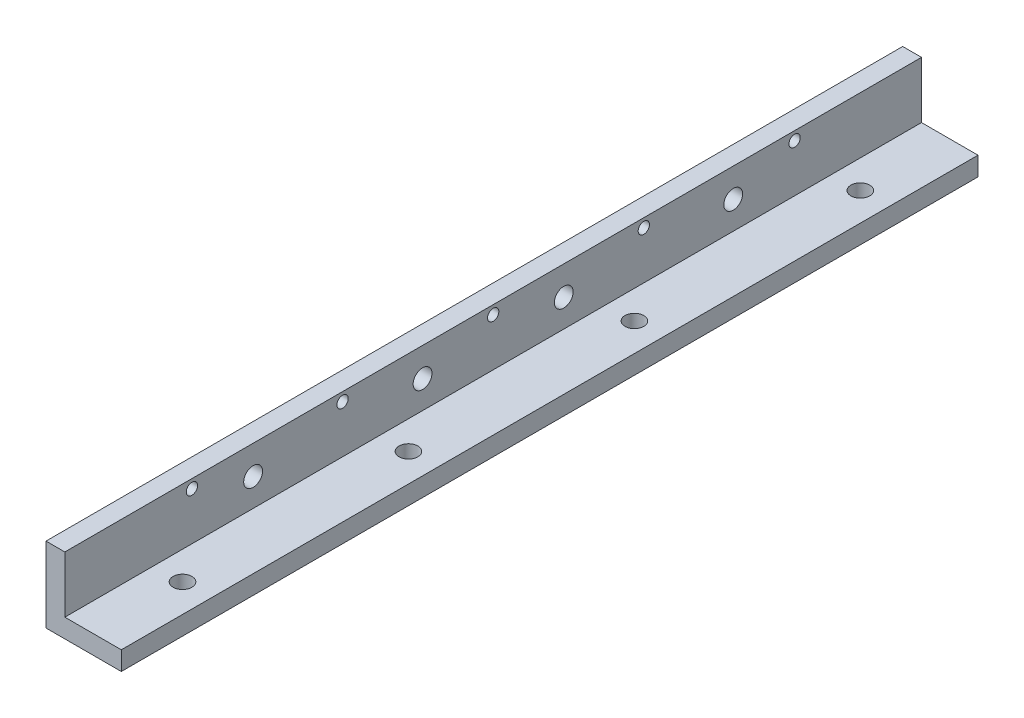
ISO-10303-21;
HEADER;
FILE_DESCRIPTION(('STEP AP214'),'2;1');
FILE_NAME('part.step','',(''),(''),'','','');
FILE_SCHEMA(('AUTOMOTIVE_DESIGN { 1 0 10303 214 1 1 1 1 }'));
ENDSEC;
DATA;
#1=APPLICATION_CONTEXT('core data for automotive mechanical design processes');
#2=APPLICATION_PROTOCOL_DEFINITION('international standard','automotive_design',2000,#1);
#3=PRODUCT_CONTEXT('',#1,'mechanical');
#4=PRODUCT('Part','Part','',(#3));
#5=PRODUCT_RELATED_PRODUCT_CATEGORY('part','',(#4));
#6=PRODUCT_DEFINITION_FORMATION('','',#4);
#7=PRODUCT_DEFINITION_CONTEXT('part definition',#1,'design');
#8=PRODUCT_DEFINITION('design','',#6,#7);
#9=PRODUCT_DEFINITION_SHAPE('','',#8);
#10=(LENGTH_UNIT() NAMED_UNIT(*) SI_UNIT(.MILLI.,.METRE.));
#11=(NAMED_UNIT(*) PLANE_ANGLE_UNIT() SI_UNIT($,.RADIAN.));
#12=(NAMED_UNIT(*) SI_UNIT($,.STERADIAN.) SOLID_ANGLE_UNIT());
#13=UNCERTAINTY_MEASURE_WITH_UNIT(LENGTH_MEASURE(1.E-05),#10,'distance_accuracy_value','');
#14=(GEOMETRIC_REPRESENTATION_CONTEXT(3) GLOBAL_UNCERTAINTY_ASSIGNED_CONTEXT((#13)) GLOBAL_UNIT_ASSIGNED_CONTEXT((#10,
#11,#12)) REPRESENTATION_CONTEXT('',''));
#15=CARTESIAN_POINT('',(0.,0.,0.));
#16=DIRECTION('',(0.,0.,1.));
#17=DIRECTION('',(1.,0.,0.));
#18=AXIS2_PLACEMENT_3D('',#15,#16,#17);
#19=CARTESIAN_POINT('',(0.,0.,227.5));
#20=DIRECTION('',(0.,1.,0.));
#21=DIRECTION('',(0.,0.,1.));
#22=AXIS2_PLACEMENT_3D('',#19,#20,#21);
#23=PLANE('',#22);
#24=CARTESIAN_POINT('',(12.5,0.,203.75));
#25=DIRECTION('',(0.,1.,0.));
#26=DIRECTION('',(0.,0.,1.));
#27=AXIS2_PLACEMENT_3D('',#24,#25,#26);
#28=CIRCLE('',#27,2.5);
#29=CARTESIAN_POINT('',(12.5,0.,206.25));
#30=VERTEX_POINT('',#29);
#31=EDGE_CURVE('E166',#30,#30,#28,.T.);
#32=ORIENTED_EDGE('',*,*,#31,.T.);
#33=EDGE_LOOP('',(#32));
#34=FACE_BOUND('',#33,.T.);
#35=CARTESIAN_POINT('',(12.5,0.,143.75));
#36=DIRECTION('',(0.,1.,0.));
#37=DIRECTION('',(0.,0.,1.));
#38=AXIS2_PLACEMENT_3D('',#35,#36,#37);
#39=CIRCLE('',#38,2.5);
#40=CARTESIAN_POINT('',(12.5,0.,146.25));
#41=VERTEX_POINT('',#40);
#42=EDGE_CURVE('E170',#41,#41,#39,.T.);
#43=ORIENTED_EDGE('',*,*,#42,.T.);
#44=EDGE_LOOP('',(#43));
#45=FACE_BOUND('',#44,.T.);
#46=CARTESIAN_POINT('',(12.5,0.,83.75));
#47=DIRECTION('',(0.,1.,0.));
#48=DIRECTION('',(0.,0.,1.));
#49=AXIS2_PLACEMENT_3D('',#46,#47,#48);
#50=CIRCLE('',#49,2.5);
#51=CARTESIAN_POINT('',(12.5,0.,86.25));
#52=VERTEX_POINT('',#51);
#53=EDGE_CURVE('E174',#52,#52,#50,.T.);
#54=ORIENTED_EDGE('',*,*,#53,.T.);
#55=EDGE_LOOP('',(#54));
#56=FACE_BOUND('',#55,.T.);
#57=CARTESIAN_POINT('',(12.5,0.,23.75));
#58=DIRECTION('',(0.,1.,0.));
#59=DIRECTION('',(0.,0.,1.));
#60=AXIS2_PLACEMENT_3D('',#57,#58,#59);
#61=CIRCLE('',#60,2.5);
#62=CARTESIAN_POINT('',(12.5,0.,26.25));
#63=VERTEX_POINT('',#62);
#64=EDGE_CURVE('E123',#63,#63,#61,.T.);
#65=ORIENTED_EDGE('',*,*,#64,.T.);
#66=EDGE_LOOP('',(#65));
#67=FACE_BOUND('',#66,.T.);
#68=DIRECTION('',(1.,0.,0.));
#69=VECTOR('',#68,1.);
#70=CARTESIAN_POINT('',(0.,0.,0.));
#71=LINE('',#70,#69);
#72=CARTESIAN_POINT('',(0.,0.,0.));
#73=VERTEX_POINT('',#72);
#74=CARTESIAN_POINT('',(20.,0.,0.));
#75=VERTEX_POINT('',#74);
#76=EDGE_CURVE('E120',#73,#75,#71,.T.);
#77=ORIENTED_EDGE('',*,*,#76,.T.);
#78=DIRECTION('',(0.,0.,-1.));
#79=VECTOR('',#78,1.);
#80=CARTESIAN_POINT('',(20.,0.,227.5));
#81=LINE('',#80,#79);
#82=CARTESIAN_POINT('',(20.,0.,227.5));
#83=VERTEX_POINT('',#82);
#84=EDGE_CURVE('E11',#83,#75,#81,.T.);
#85=ORIENTED_EDGE('',*,*,#84,.F.);
#86=DIRECTION('',(1.,0.,0.));
#87=VECTOR('',#86,1.);
#88=CARTESIAN_POINT('',(0.,0.,227.5));
#89=LINE('',#88,#87);
#90=CARTESIAN_POINT('',(0.,0.,227.5));
#91=VERTEX_POINT('',#90);
#92=EDGE_CURVE('E135',#91,#83,#89,.T.);
#93=ORIENTED_EDGE('',*,*,#92,.F.);
#94=DIRECTION('',(0.,0.,-1.));
#95=VECTOR('',#94,1.);
#96=CARTESIAN_POINT('',(0.,0.,227.5));
#97=LINE('',#96,#95);
#98=EDGE_CURVE('E52',#91,#73,#97,.T.);
#99=ORIENTED_EDGE('',*,*,#98,.T.);
#100=EDGE_LOOP('',(#77,#85,#93,#99));
#101=FACE_BOUND('',#100,.T.);
#102=ADVANCED_FACE('F36',(#34,#45,#56,#67,#101),#23,.F.);
#103=CARTESIAN_POINT('',(20.,0.,227.5));
#104=DIRECTION('',(-1.,0.,0.));
#105=DIRECTION('',(0.,0.,1.));
#106=AXIS2_PLACEMENT_3D('',#103,#104,#105);
#107=PLANE('',#106);
#108=DIRECTION('',(0.,1.,0.));
#109=VECTOR('',#108,1.);
#110=CARTESIAN_POINT('',(20.,0.,0.));
#111=LINE('',#110,#109);
#112=CARTESIAN_POINT('',(20.,5.,0.));
#113=VERTEX_POINT('',#112);
#114=EDGE_CURVE('E122',#75,#113,#111,.T.);
#115=ORIENTED_EDGE('',*,*,#114,.T.);
#116=DIRECTION('',(0.,0.,-1.));
#117=VECTOR('',#116,1.);
#118=CARTESIAN_POINT('',(20.,5.,227.5));
#119=LINE('',#118,#117);
#120=CARTESIAN_POINT('',(20.,5.,227.5));
#121=VERTEX_POINT('',#120);
#122=EDGE_CURVE('E44',#121,#113,#119,.T.);
#123=ORIENTED_EDGE('',*,*,#122,.F.);
#124=DIRECTION('',(0.,1.,0.));
#125=VECTOR('',#124,1.);
#126=CARTESIAN_POINT('',(20.,0.,227.5));
#127=LINE('',#126,#125);
#128=EDGE_CURVE('E84',#83,#121,#127,.T.);
#129=ORIENTED_EDGE('',*,*,#128,.F.);
#130=ORIENTED_EDGE('',*,*,#84,.T.);
#131=EDGE_LOOP('',(#115,#123,#129,#130));
#132=FACE_BOUND('',#131,.T.);
#133=ADVANCED_FACE('F141',(#132),#107,.F.);
#134=CARTESIAN_POINT('',(0.,5.,227.5));
#135=DIRECTION('',(0.,1.,0.));
#136=DIRECTION('',(0.,0.,1.));
#137=AXIS2_PLACEMENT_3D('',#134,#135,#136);
#138=PLANE('',#137);
#139=CARTESIAN_POINT('',(12.5,5.,203.75));
#140=DIRECTION('',(0.,1.,0.));
#141=DIRECTION('',(0.,0.,1.));
#142=AXIS2_PLACEMENT_3D('',#139,#140,#141);
#143=CIRCLE('',#142,2.5);
#144=CARTESIAN_POINT('',(12.5,5.,206.25));
#145=VERTEX_POINT('',#144);
#146=EDGE_CURVE('E193',#145,#145,#143,.T.);
#147=ORIENTED_EDGE('',*,*,#146,.F.);
#148=EDGE_LOOP('',(#147));
#149=FACE_BOUND('',#148,.T.);
#150=CARTESIAN_POINT('',(12.5,5.,143.75));
#151=DIRECTION('',(0.,1.,0.));
#152=DIRECTION('',(0.,0.,1.));
#153=AXIS2_PLACEMENT_3D('',#150,#151,#152);
#154=CIRCLE('',#153,2.5);
#155=CARTESIAN_POINT('',(12.5,5.,146.25));
#156=VERTEX_POINT('',#155);
#157=EDGE_CURVE('E189',#156,#156,#154,.T.);
#158=ORIENTED_EDGE('',*,*,#157,.F.);
#159=EDGE_LOOP('',(#158));
#160=FACE_BOUND('',#159,.T.);
#161=CARTESIAN_POINT('',(12.5,5.,83.75));
#162=DIRECTION('',(0.,1.,0.));
#163=DIRECTION('',(0.,0.,1.));
#164=AXIS2_PLACEMENT_3D('',#161,#162,#163);
#165=CIRCLE('',#164,2.5);
#166=CARTESIAN_POINT('',(12.5,5.,86.25));
#167=VERTEX_POINT('',#166);
#168=EDGE_CURVE('E185',#167,#167,#165,.T.);
#169=ORIENTED_EDGE('',*,*,#168,.F.);
#170=EDGE_LOOP('',(#169));
#171=FACE_BOUND('',#170,.T.);
#172=CARTESIAN_POINT('',(12.5,5.,23.75));
#173=DIRECTION('',(0.,1.,0.));
#174=DIRECTION('',(0.,0.,1.));
#175=AXIS2_PLACEMENT_3D('',#172,#173,#174);
#176=CIRCLE('',#175,2.5);
#177=CARTESIAN_POINT('',(12.5,5.,26.25));
#178=VERTEX_POINT('',#177);
#179=EDGE_CURVE('E181',#178,#178,#176,.T.);
#180=ORIENTED_EDGE('',*,*,#179,.F.);
#181=EDGE_LOOP('',(#180));
#182=FACE_BOUND('',#181,.T.);
#183=DIRECTION('',(1.,0.,0.));
#184=VECTOR('',#183,1.);
#185=CARTESIAN_POINT('',(0.,5.,0.));
#186=LINE('',#185,#184);
#187=CARTESIAN_POINT('',(5.,5.,0.));
#188=VERTEX_POINT('',#187);
#189=EDGE_CURVE('E126',#188,#113,#186,.T.);
#190=ORIENTED_EDGE('',*,*,#189,.F.);
#191=DIRECTION('',(0.,0.,-1.));
#192=VECTOR('',#191,1.);
#193=CARTESIAN_POINT('',(5.,5.,227.5));
#194=LINE('',#193,#192);
#195=CARTESIAN_POINT('',(5.,5.,227.5));
#196=VERTEX_POINT('',#195);
#197=EDGE_CURVE('E112',#196,#188,#194,.T.);
#198=ORIENTED_EDGE('',*,*,#197,.F.);
#199=DIRECTION('',(1.,0.,0.));
#200=VECTOR('',#199,1.);
#201=CARTESIAN_POINT('',(0.,5.,227.5));
#202=LINE('',#201,#200);
#203=EDGE_CURVE('E102',#196,#121,#202,.T.);
#204=ORIENTED_EDGE('',*,*,#203,.T.);
#205=ORIENTED_EDGE('',*,*,#122,.T.);
#206=EDGE_LOOP('',(#190,#198,#204,#205));
#207=FACE_BOUND('',#206,.T.);
#208=ADVANCED_FACE('F140',(#149,#160,#171,#182,#207),#138,.T.);
#209=CARTESIAN_POINT('',(5.,0.,227.5));
#210=DIRECTION('',(-1.,0.,0.));
#211=DIRECTION('',(0.,0.,1.));
#212=AXIS2_PLACEMENT_3D('',#209,#210,#211);
#213=PLANE('',#212);
#214=CARTESIAN_POINT('',(5.,17.6675,193.75));
#215=DIRECTION('',(-1.,0.,0.));
#216=DIRECTION('',(0.,0.,1.));
#217=AXIS2_PLACEMENT_3D('',#214,#215,#216);
#218=CIRCLE('',#217,1.5);
#219=CARTESIAN_POINT('',(5.,17.6675,195.25));
#220=VERTEX_POINT('',#219);
#221=EDGE_CURVE('E244',#220,#220,#218,.T.);
#222=ORIENTED_EDGE('',*,*,#221,.T.);
#223=EDGE_LOOP('',(#222));
#224=FACE_BOUND('',#223,.T.);
#225=CARTESIAN_POINT('',(5.,17.6675,153.75));
#226=DIRECTION('',(-1.,0.,0.));
#227=DIRECTION('',(0.,0.,1.));
#228=AXIS2_PLACEMENT_3D('',#225,#226,#227);
#229=CIRCLE('',#228,1.50000000000003);
#230=CARTESIAN_POINT('',(5.,17.6675,155.25));
#231=VERTEX_POINT('',#230);
#232=EDGE_CURVE('E238',#231,#231,#229,.T.);
#233=ORIENTED_EDGE('',*,*,#232,.T.);
#234=EDGE_LOOP('',(#233));
#235=FACE_BOUND('',#234,.T.);
#236=CARTESIAN_POINT('',(5.,17.6675,113.75));
#237=DIRECTION('',(-1.,0.,0.));
#238=DIRECTION('',(0.,0.,1.));
#239=AXIS2_PLACEMENT_3D('',#236,#237,#238);
#240=CIRCLE('',#239,1.5);
#241=CARTESIAN_POINT('',(5.,17.6675,115.25));
#242=VERTEX_POINT('',#241);
#243=EDGE_CURVE('E232',#242,#242,#240,.T.);
#244=ORIENTED_EDGE('',*,*,#243,.T.);
#245=EDGE_LOOP('',(#244));
#246=FACE_BOUND('',#245,.T.);
#247=CARTESIAN_POINT('',(5.,17.6675,73.75));
#248=DIRECTION('',(-1.,0.,0.));
#249=DIRECTION('',(0.,0.,1.));
#250=AXIS2_PLACEMENT_3D('',#247,#248,#249);
#251=CIRCLE('',#250,1.5);
#252=CARTESIAN_POINT('',(5.,17.6675,75.25));
#253=VERTEX_POINT('',#252);
#254=EDGE_CURVE('E226',#253,#253,#251,.T.);
#255=ORIENTED_EDGE('',*,*,#254,.T.);
#256=EDGE_LOOP('',(#255));
#257=FACE_BOUND('',#256,.T.);
#258=CARTESIAN_POINT('',(5.,17.6675,33.7042074641719));
#259=DIRECTION('',(-1.,0.,0.));
#260=DIRECTION('',(0.,0.,1.));
#261=AXIS2_PLACEMENT_3D('',#258,#259,#260);
#262=CIRCLE('',#261,1.49999999999999);
#263=CARTESIAN_POINT('',(5.,17.6675,35.2042074641719));
#264=VERTEX_POINT('',#263);
#265=EDGE_CURVE('E220',#264,#264,#262,.T.);
#266=ORIENTED_EDGE('',*,*,#265,.T.);
#267=EDGE_LOOP('',(#266));
#268=FACE_BOUND('',#267,.T.);
#269=CARTESIAN_POINT('',(5.,12.3461631582441,177.5));
#270=DIRECTION('',(1.,0.,0.));
#271=DIRECTION('',(0.,0.,-1.));
#272=AXIS2_PLACEMENT_3D('',#269,#270,#271);
#273=CIRCLE('',#272,2.5);
#274=CARTESIAN_POINT('',(5.,12.3461631582441,175.));
#275=VERTEX_POINT('',#274);
#276=EDGE_CURVE('E217',#275,#275,#273,.T.);
#277=ORIENTED_EDGE('',*,*,#276,.F.);
#278=EDGE_LOOP('',(#277));
#279=FACE_BOUND('',#278,.T.);
#280=CARTESIAN_POINT('',(5.,12.3461631582441,132.5));
#281=DIRECTION('',(1.,0.,0.));
#282=DIRECTION('',(0.,0.,-1.));
#283=AXIS2_PLACEMENT_3D('',#280,#281,#282);
#284=CIRCLE('',#283,2.5);
#285=CARTESIAN_POINT('',(5.,12.3461631582441,130.));
#286=VERTEX_POINT('',#285);
#287=EDGE_CURVE('E211',#286,#286,#284,.T.);
#288=ORIENTED_EDGE('',*,*,#287,.F.);
#289=EDGE_LOOP('',(#288));
#290=FACE_BOUND('',#289,.T.);
#291=CARTESIAN_POINT('',(5.,12.3461631582441,95.));
#292=DIRECTION('',(1.,0.,0.));
#293=DIRECTION('',(0.,0.,-1.));
#294=AXIS2_PLACEMENT_3D('',#291,#292,#293);
#295=CIRCLE('',#294,2.5);
#296=CARTESIAN_POINT('',(5.,12.3461631582441,92.5));
#297=VERTEX_POINT('',#296);
#298=EDGE_CURVE('E205',#297,#297,#295,.T.);
#299=ORIENTED_EDGE('',*,*,#298,.F.);
#300=EDGE_LOOP('',(#299));
#301=FACE_BOUND('',#300,.T.);
#302=CARTESIAN_POINT('',(5.,12.3461631582441,50.));
#303=DIRECTION('',(1.,0.,0.));
#304=DIRECTION('',(0.,0.,-1.));
#305=AXIS2_PLACEMENT_3D('',#302,#303,#304);
#306=CIRCLE('',#305,2.5);
#307=CARTESIAN_POINT('',(5.,12.3461631582441,47.5));
#308=VERTEX_POINT('',#307);
#309=EDGE_CURVE('E199',#308,#308,#306,.T.);
#310=ORIENTED_EDGE('',*,*,#309,.F.);
#311=EDGE_LOOP('',(#310));
#312=FACE_BOUND('',#311,.T.);
#313=DIRECTION('',(0.,1.,0.));
#314=VECTOR('',#313,1.);
#315=CARTESIAN_POINT('',(5.,0.,0.));
#316=LINE('',#315,#314);
#317=CARTESIAN_POINT('',(5.,20.,0.));
#318=VERTEX_POINT('',#317);
#319=EDGE_CURVE('E109',#188,#318,#316,.T.);
#320=ORIENTED_EDGE('',*,*,#319,.T.);
#321=DIRECTION('',(0.,0.,-1.));
#322=VECTOR('',#321,1.);
#323=CARTESIAN_POINT('',(5.,20.,227.5));
#324=LINE('',#323,#322);
#325=CARTESIAN_POINT('',(5.,20.,227.5));
#326=VERTEX_POINT('',#325);
#327=EDGE_CURVE('E106',#326,#318,#324,.T.);
#328=ORIENTED_EDGE('',*,*,#327,.F.);
#329=DIRECTION('',(0.,1.,0.));
#330=VECTOR('',#329,1.);
#331=CARTESIAN_POINT('',(5.,0.,227.5));
#332=LINE('',#331,#330);
#333=EDGE_CURVE('E95',#196,#326,#332,.T.);
#334=ORIENTED_EDGE('',*,*,#333,.F.);
#335=ORIENTED_EDGE('',*,*,#197,.T.);
#336=EDGE_LOOP('',(#320,#328,#334,#335));
#337=FACE_BOUND('',#336,.T.);
#338=ADVANCED_FACE('F107',(#224,#235,#246,#257,#268,#279,#290,#301,#312,#337),#213,.F.);
#339=CARTESIAN_POINT('',(0.,20.,227.5));
#340=DIRECTION('',(0.,1.,0.));
#341=DIRECTION('',(0.,0.,1.));
#342=AXIS2_PLACEMENT_3D('',#339,#340,#341);
#343=PLANE('',#342);
#344=DIRECTION('',(1.,0.,0.));
#345=VECTOR('',#344,1.);
#346=CARTESIAN_POINT('',(0.,20.,0.));
#347=LINE('',#346,#345);
#348=CARTESIAN_POINT('',(0.,20.,0.));
#349=VERTEX_POINT('',#348);
#350=EDGE_CURVE('E130',#349,#318,#347,.T.);
#351=ORIENTED_EDGE('',*,*,#350,.F.);
#352=DIRECTION('',(0.,0.,-1.));
#353=VECTOR('',#352,1.);
#354=CARTESIAN_POINT('',(0.,20.,227.5));
#355=LINE('',#354,#353);
#356=CARTESIAN_POINT('',(0.,20.,227.5));
#357=VERTEX_POINT('',#356);
#358=EDGE_CURVE('E72',#357,#349,#355,.T.);
#359=ORIENTED_EDGE('',*,*,#358,.F.);
#360=DIRECTION('',(1.,0.,0.));
#361=VECTOR('',#360,1.);
#362=CARTESIAN_POINT('',(0.,20.,227.5));
#363=LINE('',#362,#361);
#364=EDGE_CURVE('E100',#357,#326,#363,.T.);
#365=ORIENTED_EDGE('',*,*,#364,.T.);
#366=ORIENTED_EDGE('',*,*,#327,.T.);
#367=EDGE_LOOP('',(#351,#359,#365,#366));
#368=FACE_BOUND('',#367,.T.);
#369=ADVANCED_FACE('F114',(#368),#343,.T.);
#370=CARTESIAN_POINT('',(0.,0.,227.5));
#371=DIRECTION('',(-1.,0.,0.));
#372=DIRECTION('',(0.,0.,1.));
#373=AXIS2_PLACEMENT_3D('',#370,#371,#372);
#374=PLANE('',#373);
#375=CARTESIAN_POINT('',(0.,17.6675,193.75));
#376=DIRECTION('',(-1.,0.,0.));
#377=DIRECTION('',(0.,0.,1.));
#378=AXIS2_PLACEMENT_3D('',#375,#376,#377);
#379=CIRCLE('',#378,1.5);
#380=CARTESIAN_POINT('',(0.,17.6675,195.25));
#381=VERTEX_POINT('',#380);
#382=EDGE_CURVE('E247',#381,#381,#379,.T.);
#383=ORIENTED_EDGE('',*,*,#382,.F.);
#384=EDGE_LOOP('',(#383));
#385=FACE_BOUND('',#384,.T.);
#386=CARTESIAN_POINT('',(0.,17.6675,153.75));
#387=DIRECTION('',(-1.,0.,0.));
#388=DIRECTION('',(0.,0.,1.));
#389=AXIS2_PLACEMENT_3D('',#386,#387,#388);
#390=CIRCLE('',#389,1.50000000000003);
#391=CARTESIAN_POINT('',(0.,17.6675,155.25));
#392=VERTEX_POINT('',#391);
#393=EDGE_CURVE('E241',#392,#392,#390,.T.);
#394=ORIENTED_EDGE('',*,*,#393,.F.);
#395=EDGE_LOOP('',(#394));
#396=FACE_BOUND('',#395,.T.);
#397=CARTESIAN_POINT('',(0.,17.6675,113.75));
#398=DIRECTION('',(-1.,0.,0.));
#399=DIRECTION('',(0.,0.,1.));
#400=AXIS2_PLACEMENT_3D('',#397,#398,#399);
#401=CIRCLE('',#400,1.5);
#402=CARTESIAN_POINT('',(0.,17.6675,115.25));
#403=VERTEX_POINT('',#402);
#404=EDGE_CURVE('E235',#403,#403,#401,.T.);
#405=ORIENTED_EDGE('',*,*,#404,.F.);
#406=EDGE_LOOP('',(#405));
#407=FACE_BOUND('',#406,.T.);
#408=CARTESIAN_POINT('',(0.,17.6675,73.75));
#409=DIRECTION('',(-1.,0.,0.));
#410=DIRECTION('',(0.,0.,1.));
#411=AXIS2_PLACEMENT_3D('',#408,#409,#410);
#412=CIRCLE('',#411,1.5);
#413=CARTESIAN_POINT('',(0.,17.6675,75.25));
#414=VERTEX_POINT('',#413);
#415=EDGE_CURVE('E229',#414,#414,#412,.T.);
#416=ORIENTED_EDGE('',*,*,#415,.F.);
#417=EDGE_LOOP('',(#416));
#418=FACE_BOUND('',#417,.T.);
#419=CARTESIAN_POINT('',(0.,17.6675,33.7042074641719));
#420=DIRECTION('',(-1.,0.,0.));
#421=DIRECTION('',(0.,0.,1.));
#422=AXIS2_PLACEMENT_3D('',#419,#420,#421);
#423=CIRCLE('',#422,1.49999999999999);
#424=CARTESIAN_POINT('',(0.,17.6675,35.2042074641719));
#425=VERTEX_POINT('',#424);
#426=EDGE_CURVE('E223',#425,#425,#423,.T.);
#427=ORIENTED_EDGE('',*,*,#426,.F.);
#428=EDGE_LOOP('',(#427));
#429=FACE_BOUND('',#428,.T.);
#430=CARTESIAN_POINT('',(0.,12.3461631582441,177.5));
#431=DIRECTION('',(1.,0.,0.));
#432=DIRECTION('',(0.,0.,-1.));
#433=AXIS2_PLACEMENT_3D('',#430,#431,#432);
#434=CIRCLE('',#433,2.5);
#435=CARTESIAN_POINT('',(0.,12.3461631582441,175.));
#436=VERTEX_POINT('',#435);
#437=EDGE_CURVE('E214',#436,#436,#434,.T.);
#438=ORIENTED_EDGE('',*,*,#437,.T.);
#439=EDGE_LOOP('',(#438));
#440=FACE_BOUND('',#439,.T.);
#441=CARTESIAN_POINT('',(0.,12.3461631582441,132.5));
#442=DIRECTION('',(1.,0.,0.));
#443=DIRECTION('',(0.,0.,-1.));
#444=AXIS2_PLACEMENT_3D('',#441,#442,#443);
#445=CIRCLE('',#444,2.5);
#446=CARTESIAN_POINT('',(0.,12.3461631582441,130.));
#447=VERTEX_POINT('',#446);
#448=EDGE_CURVE('E208',#447,#447,#445,.T.);
#449=ORIENTED_EDGE('',*,*,#448,.T.);
#450=EDGE_LOOP('',(#449));
#451=FACE_BOUND('',#450,.T.);
#452=CARTESIAN_POINT('',(0.,12.3461631582441,95.));
#453=DIRECTION('',(1.,0.,0.));
#454=DIRECTION('',(0.,0.,-1.));
#455=AXIS2_PLACEMENT_3D('',#452,#453,#454);
#456=CIRCLE('',#455,2.5);
#457=CARTESIAN_POINT('',(0.,12.3461631582441,92.5));
#458=VERTEX_POINT('',#457);
#459=EDGE_CURVE('E202',#458,#458,#456,.T.);
#460=ORIENTED_EDGE('',*,*,#459,.T.);
#461=EDGE_LOOP('',(#460));
#462=FACE_BOUND('',#461,.T.);
#463=CARTESIAN_POINT('',(0.,12.3461631582441,50.));
#464=DIRECTION('',(1.,0.,0.));
#465=DIRECTION('',(0.,0.,-1.));
#466=AXIS2_PLACEMENT_3D('',#463,#464,#465);
#467=CIRCLE('',#466,2.5);
#468=CARTESIAN_POINT('',(0.,12.3461631582441,47.5));
#469=VERTEX_POINT('',#468);
#470=EDGE_CURVE('E196',#469,#469,#467,.T.);
#471=ORIENTED_EDGE('',*,*,#470,.T.);
#472=EDGE_LOOP('',(#471));
#473=FACE_BOUND('',#472,.T.);
#474=DIRECTION('',(0.,1.,0.));
#475=VECTOR('',#474,1.);
#476=CARTESIAN_POINT('',(0.,0.,0.));
#477=LINE('',#476,#475);
#478=EDGE_CURVE('E132',#73,#349,#477,.T.);
#479=ORIENTED_EDGE('',*,*,#478,.F.);
#480=ORIENTED_EDGE('',*,*,#98,.F.);
#481=DIRECTION('',(0.,1.,0.));
#482=VECTOR('',#481,1.);
#483=CARTESIAN_POINT('',(0.,0.,227.5));
#484=LINE('',#483,#482);
#485=EDGE_CURVE('E115',#91,#357,#484,.T.);
#486=ORIENTED_EDGE('',*,*,#485,.T.);
#487=ORIENTED_EDGE('',*,*,#358,.T.);
#488=EDGE_LOOP('',(#479,#480,#486,#487));
#489=FACE_BOUND('',#488,.T.);
#490=ADVANCED_FACE('F145',(#385,#396,#407,#418,#429,#440,#451,#462,#473,#489),#374,.T.);
#491=CARTESIAN_POINT('',(0.,0.,227.5));
#492=DIRECTION('',(0.,0.,1.));
#493=DIRECTION('',(1.,0.,0.));
#494=AXIS2_PLACEMENT_3D('',#491,#492,#493);
#495=PLANE('',#494);
#496=ORIENTED_EDGE('',*,*,#92,.T.);
#497=ORIENTED_EDGE('',*,*,#128,.T.);
#498=ORIENTED_EDGE('',*,*,#203,.F.);
#499=ORIENTED_EDGE('',*,*,#333,.T.);
#500=ORIENTED_EDGE('',*,*,#364,.F.);
#501=ORIENTED_EDGE('',*,*,#485,.F.);
#502=EDGE_LOOP('',(#496,#497,#498,#499,#500,#501));
#503=FACE_BOUND('',#502,.T.);
#504=ADVANCED_FACE('F97',(#503),#495,.T.);
#505=CARTESIAN_POINT('',(0.,0.,0.));
#506=DIRECTION('',(0.,0.,1.));
#507=DIRECTION('',(1.,0.,0.));
#508=AXIS2_PLACEMENT_3D('',#505,#506,#507);
#509=PLANE('',#508);
#510=ORIENTED_EDGE('',*,*,#76,.F.);
#511=ORIENTED_EDGE('',*,*,#478,.T.);
#512=ORIENTED_EDGE('',*,*,#350,.T.);
#513=ORIENTED_EDGE('',*,*,#319,.F.);
#514=ORIENTED_EDGE('',*,*,#189,.T.);
#515=ORIENTED_EDGE('',*,*,#114,.F.);
#516=EDGE_LOOP('',(#510,#511,#512,#513,#514,#515));
#517=FACE_BOUND('',#516,.T.);
#518=ADVANCED_FACE('F144',(#517),#509,.F.);
#519=CARTESIAN_POINT('',(12.5,5.,23.75));
#520=DIRECTION('',(0.,1.,0.));
#521=DIRECTION('',(0.,0.,1.));
#522=AXIS2_PLACEMENT_3D('',#519,#520,#521);
#523=CYLINDRICAL_SURFACE('',#522,2.5);
#524=ORIENTED_EDGE('',*,*,#64,.F.);
#525=EDGE_LOOP('',(#524));
#526=FACE_BOUND('',#525,.T.);
#527=ORIENTED_EDGE('',*,*,#179,.T.);
#528=EDGE_LOOP('',(#527));
#529=FACE_BOUND('',#528,.T.);
#530=ADVANCED_FACE('F301',(#526,#529),#523,.F.);
#531=CARTESIAN_POINT('',(12.5,5.,83.75));
#532=DIRECTION('',(0.,1.,0.));
#533=DIRECTION('',(0.,0.,1.));
#534=AXIS2_PLACEMENT_3D('',#531,#532,#533);
#535=CYLINDRICAL_SURFACE('',#534,2.5);
#536=ORIENTED_EDGE('',*,*,#53,.F.);
#537=EDGE_LOOP('',(#536));
#538=FACE_BOUND('',#537,.T.);
#539=ORIENTED_EDGE('',*,*,#168,.T.);
#540=EDGE_LOOP('',(#539));
#541=FACE_BOUND('',#540,.T.);
#542=ADVANCED_FACE('F297',(#538,#541),#535,.F.);
#543=CARTESIAN_POINT('',(12.5,5.,143.75));
#544=DIRECTION('',(0.,1.,0.));
#545=DIRECTION('',(0.,0.,1.));
#546=AXIS2_PLACEMENT_3D('',#543,#544,#545);
#547=CYLINDRICAL_SURFACE('',#546,2.5);
#548=ORIENTED_EDGE('',*,*,#42,.F.);
#549=EDGE_LOOP('',(#548));
#550=FACE_BOUND('',#549,.T.);
#551=ORIENTED_EDGE('',*,*,#157,.T.);
#552=EDGE_LOOP('',(#551));
#553=FACE_BOUND('',#552,.T.);
#554=ADVANCED_FACE('F289',(#550,#553),#547,.F.);
#555=CARTESIAN_POINT('',(12.5,5.,203.75));
#556=DIRECTION('',(0.,1.,0.));
#557=DIRECTION('',(0.,0.,1.));
#558=AXIS2_PLACEMENT_3D('',#555,#556,#557);
#559=CYLINDRICAL_SURFACE('',#558,2.5);
#560=ORIENTED_EDGE('',*,*,#31,.F.);
#561=EDGE_LOOP('',(#560));
#562=FACE_BOUND('',#561,.T.);
#563=ORIENTED_EDGE('',*,*,#146,.T.);
#564=EDGE_LOOP('',(#563));
#565=FACE_BOUND('',#564,.T.);
#566=ADVANCED_FACE('F279',(#562,#565),#559,.F.);
#567=CARTESIAN_POINT('',(5.,12.3461631582441,50.));
#568=DIRECTION('',(1.,0.,0.));
#569=DIRECTION('',(0.,0.,-1.));
#570=AXIS2_PLACEMENT_3D('',#567,#568,#569);
#571=CYLINDRICAL_SURFACE('',#570,2.5);
#572=ORIENTED_EDGE('',*,*,#470,.F.);
#573=EDGE_LOOP('',(#572));
#574=FACE_BOUND('',#573,.T.);
#575=ORIENTED_EDGE('',*,*,#309,.T.);
#576=EDGE_LOOP('',(#575));
#577=FACE_BOUND('',#576,.T.);
#578=ADVANCED_FACE('F276',(#574,#577),#571,.F.);
#579=CARTESIAN_POINT('',(5.,12.3461631582441,95.));
#580=DIRECTION('',(1.,0.,0.));
#581=DIRECTION('',(0.,0.,-1.));
#582=AXIS2_PLACEMENT_3D('',#579,#580,#581);
#583=CYLINDRICAL_SURFACE('',#582,2.5);
#584=ORIENTED_EDGE('',*,*,#459,.F.);
#585=EDGE_LOOP('',(#584));
#586=FACE_BOUND('',#585,.T.);
#587=ORIENTED_EDGE('',*,*,#298,.T.);
#588=EDGE_LOOP('',(#587));
#589=FACE_BOUND('',#588,.T.);
#590=ADVANCED_FACE('F278',(#586,#589),#583,.F.);
#591=CARTESIAN_POINT('',(5.,12.3461631582441,132.5));
#592=DIRECTION('',(1.,0.,0.));
#593=DIRECTION('',(0.,0.,-1.));
#594=AXIS2_PLACEMENT_3D('',#591,#592,#593);
#595=CYLINDRICAL_SURFACE('',#594,2.5);
#596=ORIENTED_EDGE('',*,*,#448,.F.);
#597=EDGE_LOOP('',(#596));
#598=FACE_BOUND('',#597,.T.);
#599=ORIENTED_EDGE('',*,*,#287,.T.);
#600=EDGE_LOOP('',(#599));
#601=FACE_BOUND('',#600,.T.);
#602=ADVANCED_FACE('F286',(#598,#601),#595,.F.);
#603=CARTESIAN_POINT('',(5.,12.3461631582441,177.5));
#604=DIRECTION('',(1.,0.,0.));
#605=DIRECTION('',(0.,0.,-1.));
#606=AXIS2_PLACEMENT_3D('',#603,#604,#605);
#607=CYLINDRICAL_SURFACE('',#606,2.5);
#608=ORIENTED_EDGE('',*,*,#437,.F.);
#609=EDGE_LOOP('',(#608));
#610=FACE_BOUND('',#609,.T.);
#611=ORIENTED_EDGE('',*,*,#276,.T.);
#612=EDGE_LOOP('',(#611));
#613=FACE_BOUND('',#612,.T.);
#614=ADVANCED_FACE('F346',(#610,#613),#607,.F.);
#615=CARTESIAN_POINT('',(29.,17.6675,33.7042074641719));
#616=DIRECTION('',(-1.,0.,0.));
#617=DIRECTION('',(0.,0.,1.));
#618=AXIS2_PLACEMENT_3D('',#615,#616,#617);
#619=CYLINDRICAL_SURFACE('',#618,1.49999999999999);
#620=ORIENTED_EDGE('',*,*,#426,.T.);
#621=EDGE_LOOP('',(#620));
#622=FACE_BOUND('',#621,.T.);
#623=ORIENTED_EDGE('',*,*,#265,.F.);
#624=EDGE_LOOP('',(#623));
#625=FACE_BOUND('',#624,.T.);
#626=ADVANCED_FACE('F355',(#622,#625),#619,.F.);
#627=CARTESIAN_POINT('',(29.,17.6675,73.75));
#628=DIRECTION('',(-1.,0.,0.));
#629=DIRECTION('',(0.,0.,1.));
#630=AXIS2_PLACEMENT_3D('',#627,#628,#629);
#631=CYLINDRICAL_SURFACE('',#630,1.5);
#632=ORIENTED_EDGE('',*,*,#415,.T.);
#633=EDGE_LOOP('',(#632));
#634=FACE_BOUND('',#633,.T.);
#635=ORIENTED_EDGE('',*,*,#254,.F.);
#636=EDGE_LOOP('',(#635));
#637=FACE_BOUND('',#636,.T.);
#638=ADVANCED_FACE('F380',(#634,#637),#631,.F.);
#639=CARTESIAN_POINT('',(29.,17.6675,113.75));
#640=DIRECTION('',(-1.,0.,0.));
#641=DIRECTION('',(0.,0.,1.));
#642=AXIS2_PLACEMENT_3D('',#639,#640,#641);
#643=CYLINDRICAL_SURFACE('',#642,1.5);
#644=ORIENTED_EDGE('',*,*,#404,.T.);
#645=EDGE_LOOP('',(#644));
#646=FACE_BOUND('',#645,.T.);
#647=ORIENTED_EDGE('',*,*,#243,.F.);
#648=EDGE_LOOP('',(#647));
#649=FACE_BOUND('',#648,.T.);
#650=ADVANCED_FACE('F390',(#646,#649),#643,.F.);
#651=CARTESIAN_POINT('',(29.,17.6675,153.75));
#652=DIRECTION('',(-1.,0.,0.));
#653=DIRECTION('',(0.,0.,1.));
#654=AXIS2_PLACEMENT_3D('',#651,#652,#653);
#655=CYLINDRICAL_SURFACE('',#654,1.50000000000003);
#656=ORIENTED_EDGE('',*,*,#393,.T.);
#657=EDGE_LOOP('',(#656));
#658=FACE_BOUND('',#657,.T.);
#659=ORIENTED_EDGE('',*,*,#232,.F.);
#660=EDGE_LOOP('',(#659));
#661=FACE_BOUND('',#660,.T.);
#662=ADVANCED_FACE('F253',(#658,#661),#655,.F.);
#663=CARTESIAN_POINT('',(29.,17.6675,193.75));
#664=DIRECTION('',(-1.,0.,0.));
#665=DIRECTION('',(0.,0.,1.));
#666=AXIS2_PLACEMENT_3D('',#663,#664,#665);
#667=CYLINDRICAL_SURFACE('',#666,1.5);
#668=ORIENTED_EDGE('',*,*,#382,.T.);
#669=EDGE_LOOP('',(#668));
#670=FACE_BOUND('',#669,.T.);
#671=ORIENTED_EDGE('',*,*,#221,.F.);
#672=EDGE_LOOP('',(#671));
#673=FACE_BOUND('',#672,.T.);
#674=ADVANCED_FACE('F250',(#670,#673),#667,.F.);
#675=CLOSED_SHELL('',(#102,#133,#208,#338,#369,#490,#504,#518,#530,#542,#554,#566,#578,#590,
#602,#614,#626,#638,#650,#662,#674));
#676=MANIFOLD_SOLID_BREP('B2',#675);
#677=ADVANCED_BREP_SHAPE_REPRESENTATION('',(#18,#676),#14);
#678=SHAPE_DEFINITION_REPRESENTATION(#9,#677);
ENDSEC;
END-ISO-10303-21;
